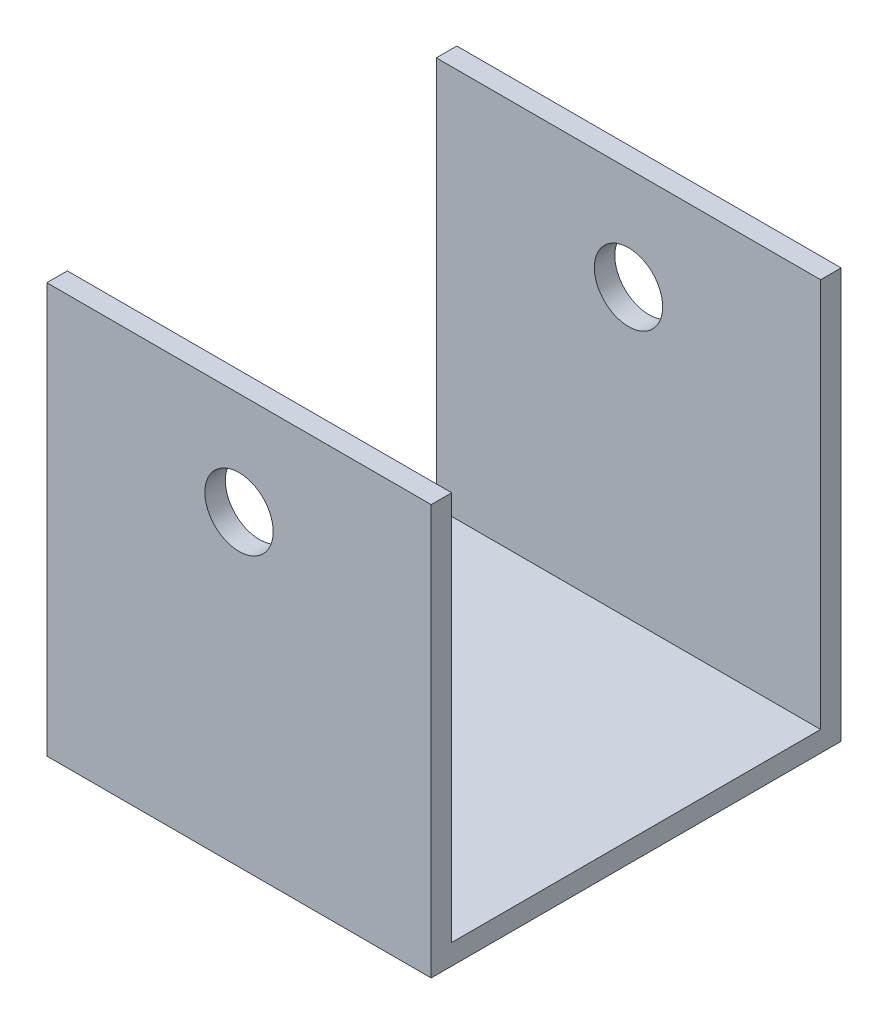
ISO-10303-21;
HEADER;
FILE_DESCRIPTION(('STEP AP214'),'2;1');
FILE_NAME('part.step','',(''),(''),'','','');
FILE_SCHEMA(('AUTOMOTIVE_DESIGN { 1 0 10303 214 1 1 1 1 }'));
ENDSEC;
DATA;
#1=APPLICATION_CONTEXT('core data for automotive mechanical design processes');
#2=APPLICATION_PROTOCOL_DEFINITION('international standard','automotive_design',2000,#1);
#3=PRODUCT_CONTEXT('',#1,'mechanical');
#4=PRODUCT('Part','Part','',(#3));
#5=PRODUCT_RELATED_PRODUCT_CATEGORY('part','',(#4));
#6=PRODUCT_DEFINITION_FORMATION('','',#4);
#7=PRODUCT_DEFINITION_CONTEXT('part definition',#1,'design');
#8=PRODUCT_DEFINITION('design','',#6,#7);
#9=PRODUCT_DEFINITION_SHAPE('','',#8);
#10=(LENGTH_UNIT() NAMED_UNIT(*) SI_UNIT(.MILLI.,.METRE.));
#11=(NAMED_UNIT(*) PLANE_ANGLE_UNIT() SI_UNIT($,.RADIAN.));
#12=(NAMED_UNIT(*) SI_UNIT($,.STERADIAN.) SOLID_ANGLE_UNIT());
#13=UNCERTAINTY_MEASURE_WITH_UNIT(LENGTH_MEASURE(1.E-05),#10,'distance_accuracy_value','');
#14=(GEOMETRIC_REPRESENTATION_CONTEXT(3) GLOBAL_UNCERTAINTY_ASSIGNED_CONTEXT((#13)) GLOBAL_UNIT_ASSIGNED_CONTEXT((#10,
#11,#12)) REPRESENTATION_CONTEXT('',''));
#15=CARTESIAN_POINT('',(0.,0.,0.));
#16=DIRECTION('',(0.,0.,1.));
#17=DIRECTION('',(1.,0.,0.));
#18=AXIS2_PLACEMENT_3D('',#15,#16,#17);
#19=CARTESIAN_POINT('',(-35.71875,38.1,38.1));
#20=DIRECTION('',(0.,-1.,0.));
#21=DIRECTION('',(0.,0.,-1.));
#22=AXIS2_PLACEMENT_3D('',#19,#20,#21);
#23=PLANE('',#22);
#24=DIRECTION('',(0.,0.,-1.));
#25=VECTOR('',#24,1.);
#26=CARTESIAN_POINT('',(-35.71875,38.1,38.1));
#27=LINE('',#26,#25);
#28=CARTESIAN_POINT('',(-35.71875,38.1,1.905));
#29=VERTEX_POINT('',#28);
#30=CARTESIAN_POINT('',(-35.71875,38.1,0.));
#31=VERTEX_POINT('',#30);
#32=EDGE_CURVE('E80',#29,#31,#27,.T.);
#33=ORIENTED_EDGE('',*,*,#32,.F.);
#34=DIRECTION('',(-1.,0.,0.));
#35=VECTOR('',#34,1.);
#36=CARTESIAN_POINT('',(0.,38.1,1.905));
#37=LINE('',#36,#35);
#38=CARTESIAN_POINT('',(0.,38.1,1.905));
#39=VERTEX_POINT('',#38);
#40=EDGE_CURVE('E142',#39,#29,#37,.T.);
#41=ORIENTED_EDGE('',*,*,#40,.F.);
#42=DIRECTION('',(0.,0.,-1.));
#43=VECTOR('',#42,1.);
#44=CARTESIAN_POINT('',(0.,38.1,38.1));
#45=LINE('',#44,#43);
#46=CARTESIAN_POINT('',(0.,38.1,0.));
#47=VERTEX_POINT('',#46);
#48=EDGE_CURVE('E131',#39,#47,#45,.T.);
#49=ORIENTED_EDGE('',*,*,#48,.T.);
#50=DIRECTION('',(-1.,0.,0.));
#51=VECTOR('',#50,1.);
#52=CARTESIAN_POINT('',(-35.71875,38.1,0.));
#53=LINE('',#52,#51);
#54=EDGE_CURVE('E150',#47,#31,#53,.T.);
#55=ORIENTED_EDGE('',*,*,#54,.T.);
#56=EDGE_LOOP('',(#33,#41,#49,#55));
#57=FACE_BOUND('',#56,.T.);
#58=ADVANCED_FACE('F33',(#57),#23,.F.);
#59=CARTESIAN_POINT('',(-35.71875,38.1,38.1));
#60=DIRECTION('',(1.,0.,0.));
#61=DIRECTION('',(0.,1.,0.));
#62=AXIS2_PLACEMENT_3D('',#59,#60,#61);
#63=PLANE('',#62);
#64=DIRECTION('',(0.,0.,1.));
#65=VECTOR('',#64,1.);
#66=CARTESIAN_POINT('',(-35.71875,1.905,1.905));
#67=LINE('',#66,#65);
#68=CARTESIAN_POINT('',(-35.71875,1.905,1.905));
#69=VERTEX_POINT('',#68);
#70=CARTESIAN_POINT('',(-35.71875,1.905,36.195));
#71=VERTEX_POINT('',#70);
#72=EDGE_CURVE('E133',#69,#71,#67,.T.);
#73=ORIENTED_EDGE('',*,*,#72,.F.);
#74=DIRECTION('',(0.,-1.,0.));
#75=VECTOR('',#74,1.);
#76=CARTESIAN_POINT('',(-35.71875,38.1,1.905));
#77=LINE('',#76,#75);
#78=EDGE_CURVE('E114',#29,#69,#77,.T.);
#79=ORIENTED_EDGE('',*,*,#78,.F.);
#80=ORIENTED_EDGE('',*,*,#32,.T.);
#81=DIRECTION('',(0.,-1.,0.));
#82=VECTOR('',#81,1.);
#83=CARTESIAN_POINT('',(-35.71875,38.1,0.));
#84=LINE('',#83,#82);
#85=CARTESIAN_POINT('',(-35.71875,0.,0.));
#86=VERTEX_POINT('',#85);
#87=EDGE_CURVE('E144',#31,#86,#84,.T.);
#88=ORIENTED_EDGE('',*,*,#87,.T.);
#89=DIRECTION('',(0.,0.,-1.));
#90=VECTOR('',#89,1.);
#91=CARTESIAN_POINT('',(-35.71875,0.,38.1));
#92=LINE('',#91,#90);
#93=CARTESIAN_POINT('',(-35.71875,0.,38.1));
#94=VERTEX_POINT('',#93);
#95=EDGE_CURVE('E11',#94,#86,#92,.T.);
#96=ORIENTED_EDGE('',*,*,#95,.F.);
#97=DIRECTION('',(0.,-1.,0.));
#98=VECTOR('',#97,1.);
#99=CARTESIAN_POINT('',(-35.71875,38.1,38.1));
#100=LINE('',#99,#98);
#101=CARTESIAN_POINT('',(-35.71875,38.1,38.1));
#102=VERTEX_POINT('',#101);
#103=EDGE_CURVE('E148',#102,#94,#100,.T.);
#104=ORIENTED_EDGE('',*,*,#103,.F.);
#105=CARTESIAN_POINT('',(-35.71875,38.1,36.195));
#106=VERTEX_POINT('',#105);
#107=EDGE_CURVE('E161',#102,#106,#27,.T.);
#108=ORIENTED_EDGE('',*,*,#107,.T.);
#109=DIRECTION('',(0.,1.,0.));
#110=VECTOR('',#109,1.);
#111=CARTESIAN_POINT('',(-35.71875,38.1,36.195));
#112=LINE('',#111,#110);
#113=EDGE_CURVE('E49',#71,#106,#112,.T.);
#114=ORIENTED_EDGE('',*,*,#113,.F.);
#115=EDGE_LOOP('',(#73,#79,#80,#88,#96,#104,#108,#114));
#116=FACE_BOUND('',#115,.T.);
#117=ADVANCED_FACE('F35',(#116),#63,.F.);
#118=CARTESIAN_POINT('',(-35.71875,0.,38.1));
#119=DIRECTION('',(0.,1.,0.));
#120=DIRECTION('',(0.,0.,1.));
#121=AXIS2_PLACEMENT_3D('',#118,#119,#120);
#122=PLANE('',#121);
#123=DIRECTION('',(1.,0.,0.));
#124=VECTOR('',#123,1.);
#125=CARTESIAN_POINT('',(-35.71875,0.,0.));
#126=LINE('',#125,#124);
#127=CARTESIAN_POINT('',(0.,0.,0.));
#128=VERTEX_POINT('',#127);
#129=EDGE_CURVE('E156',#86,#128,#126,.T.);
#130=ORIENTED_EDGE('',*,*,#129,.T.);
#131=DIRECTION('',(0.,0.,-1.));
#132=VECTOR('',#131,1.);
#133=CARTESIAN_POINT('',(0.,0.,38.1));
#134=LINE('',#133,#132);
#135=CARTESIAN_POINT('',(0.,0.,38.1));
#136=VERTEX_POINT('',#135);
#137=EDGE_CURVE('E42',#136,#128,#134,.T.);
#138=ORIENTED_EDGE('',*,*,#137,.F.);
#139=DIRECTION('',(1.,0.,0.));
#140=VECTOR('',#139,1.);
#141=CARTESIAN_POINT('',(-35.71875,0.,38.1));
#142=LINE('',#141,#140);
#143=EDGE_CURVE('E87',#94,#136,#142,.T.);
#144=ORIENTED_EDGE('',*,*,#143,.F.);
#145=ORIENTED_EDGE('',*,*,#95,.T.);
#146=EDGE_LOOP('',(#130,#138,#144,#145));
#147=FACE_BOUND('',#146,.T.);
#148=ADVANCED_FACE('F199',(#147),#122,.F.);
#149=CARTESIAN_POINT('',(0.,38.1,38.1));
#150=DIRECTION('',(-1.,0.,0.));
#151=DIRECTION('',(0.,-1.,0.));
#152=AXIS2_PLACEMENT_3D('',#149,#150,#151);
#153=PLANE('',#152);
#154=ORIENTED_EDGE('',*,*,#48,.F.);
#155=DIRECTION('',(0.,-1.,0.));
#156=VECTOR('',#155,1.);
#157=CARTESIAN_POINT('',(0.,38.1,1.905));
#158=LINE('',#157,#156);
#159=CARTESIAN_POINT('',(0.,1.90499999999999,1.905));
#160=VERTEX_POINT('',#159);
#161=EDGE_CURVE('E112',#39,#160,#158,.T.);
#162=ORIENTED_EDGE('',*,*,#161,.T.);
#163=DIRECTION('',(0.,0.,1.));
#164=VECTOR('',#163,1.);
#165=CARTESIAN_POINT('',(0.,1.90499999999999,1.905));
#166=LINE('',#165,#164);
#167=CARTESIAN_POINT('',(0.,1.90499999999999,36.195));
#168=VERTEX_POINT('',#167);
#169=EDGE_CURVE('E122',#160,#168,#166,.T.);
#170=ORIENTED_EDGE('',*,*,#169,.T.);
#171=DIRECTION('',(0.,1.,0.));
#172=VECTOR('',#171,1.);
#173=CARTESIAN_POINT('',(0.,38.1,36.195));
#174=LINE('',#173,#172);
#175=CARTESIAN_POINT('',(0.,38.1,36.195));
#176=VERTEX_POINT('',#175);
#177=EDGE_CURVE('E119',#168,#176,#174,.T.);
#178=ORIENTED_EDGE('',*,*,#177,.T.);
#179=CARTESIAN_POINT('',(0.,38.1,38.1));
#180=VERTEX_POINT('',#179);
#181=EDGE_CURVE('E164',#180,#176,#45,.T.);
#182=ORIENTED_EDGE('',*,*,#181,.F.);
#183=DIRECTION('',(0.,1.,0.));
#184=VECTOR('',#183,1.);
#185=CARTESIAN_POINT('',(0.,38.1,38.1));
#186=LINE('',#185,#184);
#187=EDGE_CURVE('E152',#136,#180,#186,.T.);
#188=ORIENTED_EDGE('',*,*,#187,.F.);
#189=ORIENTED_EDGE('',*,*,#137,.T.);
#190=DIRECTION('',(0.,1.,0.));
#191=VECTOR('',#190,1.);
#192=CARTESIAN_POINT('',(0.,38.1,0.));
#193=LINE('',#192,#191);
#194=EDGE_CURVE('E158',#128,#47,#193,.T.);
#195=ORIENTED_EDGE('',*,*,#194,.T.);
#196=EDGE_LOOP('',(#154,#162,#170,#178,#182,#188,#189,#195));
#197=FACE_BOUND('',#196,.T.);
#198=ADVANCED_FACE('F129',(#197),#153,.F.);
#199=ORIENTED_EDGE('',*,*,#181,.T.);
#200=DIRECTION('',(-1.,0.,0.));
#201=VECTOR('',#200,1.);
#202=CARTESIAN_POINT('',(0.,38.1,36.195));
#203=LINE('',#202,#201);
#204=EDGE_CURVE('E145',#176,#106,#203,.T.);
#205=ORIENTED_EDGE('',*,*,#204,.T.);
#206=ORIENTED_EDGE('',*,*,#107,.F.);
#207=DIRECTION('',(-1.,0.,0.));
#208=VECTOR('',#207,1.);
#209=CARTESIAN_POINT('',(-35.71875,38.1,38.1));
#210=LINE('',#209,#208);
#211=EDGE_CURVE('E58',#180,#102,#210,.T.);
#212=ORIENTED_EDGE('',*,*,#211,.F.);
#213=EDGE_LOOP('',(#199,#205,#206,#212));
#214=FACE_BOUND('',#213,.T.);
#215=ADVANCED_FACE('F179',(#214),#23,.F.);
#216=CARTESIAN_POINT('',(0.,0.,38.1));
#217=DIRECTION('',(0.,0.,1.));
#218=DIRECTION('',(1.,0.,0.));
#219=AXIS2_PLACEMENT_3D('',#216,#217,#218);
#220=PLANE('',#219);
#221=CARTESIAN_POINT('',(-17.859375,28.575,38.1));
#222=DIRECTION('',(0.,0.,-1.));
#223=DIRECTION('',(0.,1.,0.));
#224=AXIS2_PLACEMENT_3D('',#221,#222,#223);
#225=CIRCLE('',#224,3.175);
#226=CARTESIAN_POINT('',(-17.859375,31.75,38.1));
#227=VERTEX_POINT('',#226);
#228=EDGE_CURVE('E286',#227,#227,#225,.T.);
#229=ORIENTED_EDGE('',*,*,#228,.T.);
#230=EDGE_LOOP('',(#229));
#231=FACE_BOUND('',#230,.T.);
#232=ORIENTED_EDGE('',*,*,#103,.T.);
#233=ORIENTED_EDGE('',*,*,#143,.T.);
#234=ORIENTED_EDGE('',*,*,#187,.T.);
#235=ORIENTED_EDGE('',*,*,#211,.T.);
#236=EDGE_LOOP('',(#232,#233,#234,#235));
#237=FACE_BOUND('',#236,.T.);
#238=ADVANCED_FACE('F203',(#231,#237),#220,.T.);
#239=CARTESIAN_POINT('',(0.,0.,0.));
#240=DIRECTION('',(0.,0.,1.));
#241=DIRECTION('',(1.,0.,0.));
#242=AXIS2_PLACEMENT_3D('',#239,#240,#241);
#243=PLANE('',#242);
#244=CARTESIAN_POINT('',(-17.859375,28.575,0.));
#245=DIRECTION('',(0.,0.,-1.));
#246=DIRECTION('',(0.,1.,0.));
#247=AXIS2_PLACEMENT_3D('',#244,#245,#246);
#248=CIRCLE('',#247,3.175);
#249=CARTESIAN_POINT('',(-17.859375,31.75,0.));
#250=VERTEX_POINT('',#249);
#251=EDGE_CURVE('E283',#250,#250,#248,.T.);
#252=ORIENTED_EDGE('',*,*,#251,.F.);
#253=EDGE_LOOP('',(#252));
#254=FACE_BOUND('',#253,.T.);
#255=ORIENTED_EDGE('',*,*,#87,.F.);
#256=ORIENTED_EDGE('',*,*,#54,.F.);
#257=ORIENTED_EDGE('',*,*,#194,.F.);
#258=ORIENTED_EDGE('',*,*,#129,.F.);
#259=EDGE_LOOP('',(#255,#256,#257,#258));
#260=FACE_BOUND('',#259,.T.);
#261=ADVANCED_FACE('F174',(#254,#260),#243,.F.);
#262=CARTESIAN_POINT('',(0.,38.1,1.905));
#263=DIRECTION('',(0.,0.,-1.));
#264=DIRECTION('',(0.,1.,0.));
#265=AXIS2_PLACEMENT_3D('',#262,#263,#264);
#266=PLANE('',#265);
#267=CARTESIAN_POINT('',(-17.859375,28.575,1.905));
#268=DIRECTION('',(0.,0.,-1.));
#269=DIRECTION('',(0.,1.,0.));
#270=AXIS2_PLACEMENT_3D('',#267,#268,#269);
#271=CIRCLE('',#270,3.175);
#272=CARTESIAN_POINT('',(-17.859375,31.75,1.90499999999999));
#273=VERTEX_POINT('',#272);
#274=EDGE_CURVE('E136',#273,#273,#271,.T.);
#275=ORIENTED_EDGE('',*,*,#274,.T.);
#276=EDGE_LOOP('',(#275));
#277=FACE_BOUND('',#276,.T.);
#278=ORIENTED_EDGE('',*,*,#78,.T.);
#279=DIRECTION('',(-1.,0.,0.));
#280=VECTOR('',#279,1.);
#281=CARTESIAN_POINT('',(0.,1.90499999999999,1.905));
#282=LINE('',#281,#280);
#283=EDGE_CURVE('E108',#160,#69,#282,.T.);
#284=ORIENTED_EDGE('',*,*,#283,.F.);
#285=ORIENTED_EDGE('',*,*,#161,.F.);
#286=ORIENTED_EDGE('',*,*,#40,.T.);
#287=EDGE_LOOP('',(#278,#284,#285,#286));
#288=FACE_BOUND('',#287,.T.);
#289=ADVANCED_FACE('F110',(#277,#288),#266,.F.);
#290=CARTESIAN_POINT('',(0.,38.1,36.195));
#291=DIRECTION('',(0.,0.,1.));
#292=DIRECTION('',(0.,-1.,0.));
#293=AXIS2_PLACEMENT_3D('',#290,#291,#292);
#294=PLANE('',#293);
#295=CARTESIAN_POINT('',(-17.859375,28.575,36.195));
#296=DIRECTION('',(0.,0.,1.));
#297=DIRECTION('',(0.,-1.,0.));
#298=AXIS2_PLACEMENT_3D('',#295,#296,#297);
#299=CIRCLE('',#298,3.175);
#300=CARTESIAN_POINT('',(-17.859375,31.75,36.195));
#301=VERTEX_POINT('',#300);
#302=EDGE_CURVE('E37',#301,#301,#299,.T.);
#303=ORIENTED_EDGE('',*,*,#302,.T.);
#304=EDGE_LOOP('',(#303));
#305=FACE_BOUND('',#304,.T.);
#306=ORIENTED_EDGE('',*,*,#113,.T.);
#307=ORIENTED_EDGE('',*,*,#204,.F.);
#308=ORIENTED_EDGE('',*,*,#177,.F.);
#309=DIRECTION('',(-1.,0.,0.));
#310=VECTOR('',#309,1.);
#311=CARTESIAN_POINT('',(0.,1.90499999999999,36.195));
#312=LINE('',#311,#310);
#313=EDGE_CURVE('E118',#168,#71,#312,.T.);
#314=ORIENTED_EDGE('',*,*,#313,.T.);
#315=EDGE_LOOP('',(#306,#307,#308,#314));
#316=FACE_BOUND('',#315,.T.);
#317=ADVANCED_FACE('F180',(#305,#316),#294,.F.);
#318=CARTESIAN_POINT('',(0.,1.90499999999999,1.905));
#319=DIRECTION('',(0.,-1.,0.));
#320=DIRECTION('',(1.,0.,0.));
#321=AXIS2_PLACEMENT_3D('',#318,#319,#320);
#322=PLANE('',#321);
#323=ORIENTED_EDGE('',*,*,#72,.T.);
#324=ORIENTED_EDGE('',*,*,#313,.F.);
#325=ORIENTED_EDGE('',*,*,#169,.F.);
#326=ORIENTED_EDGE('',*,*,#283,.T.);
#327=EDGE_LOOP('',(#323,#324,#325,#326));
#328=FACE_BOUND('',#327,.T.);
#329=ADVANCED_FACE('F123',(#328),#322,.F.);
#330=CARTESIAN_POINT('',(-17.859375,28.575,38.1));
#331=DIRECTION('',(0.,0.,-1.));
#332=DIRECTION('',(0.,1.,0.));
#333=AXIS2_PLACEMENT_3D('',#330,#331,#332);
#334=CYLINDRICAL_SURFACE('',#333,3.175);
#335=CARTESIAN_POINT('',(-17.859375,31.75,38.1));
#336=CARTESIAN_POINT('',(-17.859375,31.75,38.08015625));
#337=CARTESIAN_POINT('',(-17.859375,31.75,38.0603125));
#338=CARTESIAN_POINT('',(-17.859375,31.75,38.020625));
#339=CARTESIAN_POINT('',(-17.859375,31.75,38.00078125));
#340=CARTESIAN_POINT('',(-17.859375,31.75,37.96109375));
#341=CARTESIAN_POINT('',(-17.859375,31.75,37.94125));
#342=CARTESIAN_POINT('',(-17.859375,31.75,37.9015625));
#343=CARTESIAN_POINT('',(-17.859375,31.75,37.88171875));
#344=CARTESIAN_POINT('',(-17.859375,31.75,37.84203125));
#345=CARTESIAN_POINT('',(-17.859375,31.75,37.8221875));
#346=CARTESIAN_POINT('',(-17.859375,31.75,37.7825));
#347=CARTESIAN_POINT('',(-17.859375,31.75,37.76265625));
#348=CARTESIAN_POINT('',(-17.859375,31.75,37.72296875));
#349=CARTESIAN_POINT('',(-17.859375,31.75,37.703125));
#350=CARTESIAN_POINT('',(-17.859375,31.75,37.6634375));
#351=CARTESIAN_POINT('',(-17.859375,31.75,37.64359375));
#352=CARTESIAN_POINT('',(-17.859375,31.75,37.60390625));
#353=CARTESIAN_POINT('',(-17.859375,31.75,37.5840625));
#354=CARTESIAN_POINT('',(-17.859375,31.75,37.544375));
#355=CARTESIAN_POINT('',(-17.859375,31.75,37.52453125));
#356=CARTESIAN_POINT('',(-17.859375,31.75,37.48484375));
#357=CARTESIAN_POINT('',(-17.859375,31.75,37.465));
#358=CARTESIAN_POINT('',(-17.859375,31.75,37.4253125));
#359=CARTESIAN_POINT('',(-17.859375,31.75,37.40546875));
#360=CARTESIAN_POINT('',(-17.859375,31.75,37.36578125));
#361=CARTESIAN_POINT('',(-17.859375,31.75,37.3459375));
#362=CARTESIAN_POINT('',(-17.859375,31.75,37.30625));
#363=CARTESIAN_POINT('',(-17.859375,31.75,37.28640625));
#364=CARTESIAN_POINT('',(-17.859375,31.75,37.24671875));
#365=CARTESIAN_POINT('',(-17.859375,31.75,37.226875));
#366=CARTESIAN_POINT('',(-17.859375,31.75,37.1871875));
#367=CARTESIAN_POINT('',(-17.859375,31.75,37.16734375));
#368=CARTESIAN_POINT('',(-17.859375,31.75,37.12765625));
#369=CARTESIAN_POINT('',(-17.859375,31.75,37.1078125));
#370=CARTESIAN_POINT('',(-17.859375,31.75,37.068125));
#371=CARTESIAN_POINT('',(-17.859375,31.75,37.04828125));
#372=CARTESIAN_POINT('',(-17.859375,31.75,37.00859375));
#373=CARTESIAN_POINT('',(-17.859375,31.75,36.98875));
#374=CARTESIAN_POINT('',(-17.859375,31.75,36.9490625));
#375=CARTESIAN_POINT('',(-17.859375,31.75,36.92921875));
#376=CARTESIAN_POINT('',(-17.859375,31.75,36.88953125));
#377=CARTESIAN_POINT('',(-17.859375,31.75,36.8696875));
#378=CARTESIAN_POINT('',(-17.859375,31.75,36.83));
#379=CARTESIAN_POINT('',(-17.859375,31.75,36.81015625));
#380=CARTESIAN_POINT('',(-17.859375,31.75,36.77046875));
#381=CARTESIAN_POINT('',(-17.859375,31.75,36.750625));
#382=CARTESIAN_POINT('',(-17.859375,31.75,36.7109375));
#383=CARTESIAN_POINT('',(-17.859375,31.75,36.69109375));
#384=CARTESIAN_POINT('',(-17.859375,31.75,36.65140625));
#385=CARTESIAN_POINT('',(-17.859375,31.75,36.6315625));
#386=CARTESIAN_POINT('',(-17.859375,31.75,36.591875));
#387=CARTESIAN_POINT('',(-17.859375,31.75,36.57203125));
#388=CARTESIAN_POINT('',(-17.859375,31.75,36.53234375));
#389=CARTESIAN_POINT('',(-17.859375,31.75,36.5125));
#390=CARTESIAN_POINT('',(-17.859375,31.75,36.4728125));
#391=CARTESIAN_POINT('',(-17.859375,31.75,36.45296875));
#392=CARTESIAN_POINT('',(-17.859375,31.75,36.41328125));
#393=CARTESIAN_POINT('',(-17.859375,31.75,36.3934375));
#394=CARTESIAN_POINT('',(-17.859375,31.75,36.35375));
#395=CARTESIAN_POINT('',(-17.859375,31.75,36.33390625));
#396=CARTESIAN_POINT('',(-17.859375,31.75,36.29421875));
#397=CARTESIAN_POINT('',(-17.859375,31.75,36.274375));
#398=CARTESIAN_POINT('',(-17.859375,31.75,36.2346875));
#399=CARTESIAN_POINT('',(-17.859375,31.75,36.21484375));
#400=CARTESIAN_POINT('',(-17.859375,31.75,36.195));
#401=B_SPLINE_CURVE_WITH_KNOTS('',3,(#335,#336,#337,#338,#339,#340,#341,#342,#343,#344,#345,
#346,#347,#348,#349,#350,#351,#352,#353,#354,#355,#356,#357,#358,#359,#360,#361,#362,#363,#364,
#365,#366,#367,#368,#369,#370,#371,#372,#373,#374,#375,#376,#377,#378,#379,#380,#381,#382,#383,
#384,#385,#386,#387,#388,#389,#390,#391,#392,#393,#394,#395,#396,#397,#398,#399,#400),
.UNSPECIFIED.,.F.,.F.,(4,2,2,2,2,2,2,2,2,2,2,2,2,2,2,2,2,2,2,2,2,2,2,2,2,2,2,2,2,2,2,2,4),(0.,
0.0595312500000014,0.119062500000003,0.178593750000004,0.238125000000006,0.29765625,
0.357187500000002,0.416718750000003,0.476250000000004,0.535781250000006,0.5953125,
0.654843750000002,0.714375000000003,0.773906250000005,0.833437499999999,0.892968750000001,
0.952500000000002,1.01203125,1.0715625,1.13109375,1.190625,1.25015625,1.3096875,1.36921875,
1.42875,1.48828125,1.5478125,1.60734375,1.666875,1.72640625,1.7859375,1.84546875,1.905),.UNSPECIFIED.);
#402=EDGE_CURVE('BSEAM188',#227,#301,#401,.T.);
#403=ORIENTED_EDGE('',*,*,#228,.F.);
#404=ORIENTED_EDGE('',*,*,#302,.F.);
#405=ORIENTED_EDGE('',*,*,#402,.T.);
#406=ORIENTED_EDGE('',*,*,#402,.F.);
#407=EDGE_LOOP('',(#403,#405,#404,#406));
#408=FACE_BOUND('',#407,.T.);
#409=ADVANCED_FACE('F188',(#408),#334,.F.);
#410=CARTESIAN_POINT('',(-17.859375,31.75,0.));
#411=CARTESIAN_POINT('',(-17.859375,31.75,0.0198437499999866));
#412=CARTESIAN_POINT('',(-17.859375,31.75,0.0396874999999871));
#413=CARTESIAN_POINT('',(-17.859375,31.75,0.079374999999988));
#414=CARTESIAN_POINT('',(-17.859375,31.75,0.0992187499999885));
#415=CARTESIAN_POINT('',(-17.859375,31.75,0.138906249999987));
#416=CARTESIAN_POINT('',(-17.859375,31.75,0.158749999999985));
#417=CARTESIAN_POINT('',(-17.859375,31.75,0.198437499999984));
#418=CARTESIAN_POINT('',(-17.859375,31.75,0.218281249999984));
#419=CARTESIAN_POINT('',(-17.859375,31.75,0.257968749999985));
#420=CARTESIAN_POINT('',(-17.859375,31.75,0.277812499999986));
#421=CARTESIAN_POINT('',(-17.859375,31.75,0.317499999999987));
#422=CARTESIAN_POINT('',(-17.859375,31.75,0.337343749999987));
#423=CARTESIAN_POINT('',(-17.859375,31.75,0.377031249999988));
#424=CARTESIAN_POINT('',(-17.859375,31.75,0.396874999999989));
#425=CARTESIAN_POINT('',(-17.859375,31.75,0.436562499999987));
#426=CARTESIAN_POINT('',(-17.859375,31.75,0.456406249999985));
#427=CARTESIAN_POINT('',(-17.859375,31.75,0.496093749999984));
#428=CARTESIAN_POINT('',(-17.859375,31.75,0.515937499999985));
#429=CARTESIAN_POINT('',(-17.859375,31.75,0.555624999999985));
#430=CARTESIAN_POINT('',(-17.859375,31.75,0.575468749999986));
#431=CARTESIAN_POINT('',(-17.859375,31.75,0.615156249999987));
#432=CARTESIAN_POINT('',(-17.859375,31.75,0.634999999999987));
#433=CARTESIAN_POINT('',(-17.859375,31.75,0.674687499999988));
#434=CARTESIAN_POINT('',(-17.859375,31.75,0.694531249999989));
#435=CARTESIAN_POINT('',(-17.859375,31.75,0.73421874999999));
#436=CARTESIAN_POINT('',(-17.859375,31.75,0.75406249999999));
#437=CARTESIAN_POINT('',(-17.859375,31.75,0.793749999999989));
#438=CARTESIAN_POINT('',(-17.859375,31.75,0.813593749999987));
#439=CARTESIAN_POINT('',(-17.859375,31.75,0.853281249999986));
#440=CARTESIAN_POINT('',(-17.859375,31.75,0.873124999999986));
#441=CARTESIAN_POINT('',(-17.859375,31.75,0.912812499999987));
#442=CARTESIAN_POINT('',(-17.859375,31.75,0.932656249999988));
#443=CARTESIAN_POINT('',(-17.859375,31.75,0.972343749999989));
#444=CARTESIAN_POINT('',(-17.859375,31.75,0.992187499999989));
#445=CARTESIAN_POINT('',(-17.859375,31.75,1.03187499999999));
#446=CARTESIAN_POINT('',(-17.859375,31.75,1.05171874999999));
#447=CARTESIAN_POINT('',(-17.859375,31.75,1.09140624999999));
#448=CARTESIAN_POINT('',(-17.859375,31.75,1.11124999999999));
#449=CARTESIAN_POINT('',(-17.859375,31.75,1.15093749999999));
#450=CARTESIAN_POINT('',(-17.859375,31.75,1.17078124999999));
#451=CARTESIAN_POINT('',(-17.859375,31.75,1.21046874999999));
#452=CARTESIAN_POINT('',(-17.859375,31.75,1.23031249999999));
#453=CARTESIAN_POINT('',(-17.859375,31.75,1.26999999999999));
#454=CARTESIAN_POINT('',(-17.859375,31.75,1.28984374999999));
#455=CARTESIAN_POINT('',(-17.859375,31.75,1.32953124999999));
#456=CARTESIAN_POINT('',(-17.859375,31.75,1.34937499999999));
#457=CARTESIAN_POINT('',(-17.859375,31.75,1.38906249999999));
#458=CARTESIAN_POINT('',(-17.859375,31.75,1.40890624999999));
#459=CARTESIAN_POINT('',(-17.859375,31.75,1.44859374999999));
#460=CARTESIAN_POINT('',(-17.859375,31.75,1.46843749999999));
#461=CARTESIAN_POINT('',(-17.859375,31.75,1.50812499999999));
#462=CARTESIAN_POINT('',(-17.859375,31.75,1.52796874999999));
#463=CARTESIAN_POINT('',(-17.859375,31.75,1.56765624999999));
#464=CARTESIAN_POINT('',(-17.859375,31.75,1.58749999999999));
#465=CARTESIAN_POINT('',(-17.859375,31.75,1.62718749999999));
#466=CARTESIAN_POINT('',(-17.859375,31.75,1.64703124999999));
#467=CARTESIAN_POINT('',(-17.859375,31.75,1.68671874999999));
#468=CARTESIAN_POINT('',(-17.859375,31.75,1.70656249999999));
#469=CARTESIAN_POINT('',(-17.859375,31.75,1.74624999999999));
#470=CARTESIAN_POINT('',(-17.859375,31.75,1.76609374999999));
#471=CARTESIAN_POINT('',(-17.859375,31.75,1.80578124999999));
#472=CARTESIAN_POINT('',(-17.859375,31.75,1.82562499999999));
#473=CARTESIAN_POINT('',(-17.859375,31.75,1.86531249999999));
#474=CARTESIAN_POINT('',(-17.859375,31.75,1.88515624999999));
#475=CARTESIAN_POINT('',(-17.859375,31.75,1.90499999999999));
#476=B_SPLINE_CURVE_WITH_KNOTS('',3,(#410,#411,#412,#413,#414,#415,#416,#417,#418,#419,#420,
#421,#422,#423,#424,#425,#426,#427,#428,#429,#430,#431,#432,#433,#434,#435,#436,#437,#438,#439,
#440,#441,#442,#443,#444,#445,#446,#447,#448,#449,#450,#451,#452,#453,#454,#455,#456,#457,#458,
#459,#460,#461,#462,#463,#464,#465,#466,#467,#468,#469,#470,#471,#472,#473,#474,#475),
.UNSPECIFIED.,.F.,.F.,(4,2,2,2,2,2,2,2,2,2,2,2,2,2,2,2,2,2,2,2,2,2,2,2,2,2,2,2,2,2,2,2,4),(0.,
0.0595312500000014,0.119062500000003,0.178593749999997,0.238124999999999,0.29765625,
0.357187500000002,0.416718750000003,0.476249999999998,0.535781249999999,0.5953125,
0.654843750000002,0.714375000000003,0.773906250000005,0.833437499999999,0.892968750000001,
0.952500000000002,1.01203125,1.0715625,1.13109375,1.190625,1.25015625,1.3096875,
1.36921875000001,1.42875000000001,1.48828125,1.5478125,1.60734375,1.66687500000001,
1.72640625000001,1.7859375,1.84546875,1.905),.UNSPECIFIED.);
#477=EDGE_CURVE('BSEAM268',#250,#273,#476,.T.);
#478=ORIENTED_EDGE('',*,*,#251,.T.);
#479=ORIENTED_EDGE('',*,*,#274,.F.);
#480=ORIENTED_EDGE('',*,*,#477,.T.);
#481=ORIENTED_EDGE('',*,*,#477,.F.);
#482=EDGE_LOOP('',(#478,#480,#479,#481));
#483=FACE_BOUND('',#482,.T.);
#484=ADVANCED_FACE('F268',(#483),#334,.F.);
#485=CLOSED_SHELL('',(#58,#117,#148,#198,#215,#238,#261,#289,#317,#329,#409,#484));
#486=MANIFOLD_SOLID_BREP('B2',#485);
#487=ADVANCED_BREP_SHAPE_REPRESENTATION('',(#18,#486),#14);
#488=SHAPE_DEFINITION_REPRESENTATION(#9,#487);
ENDSEC;
END-ISO-10303-21;
